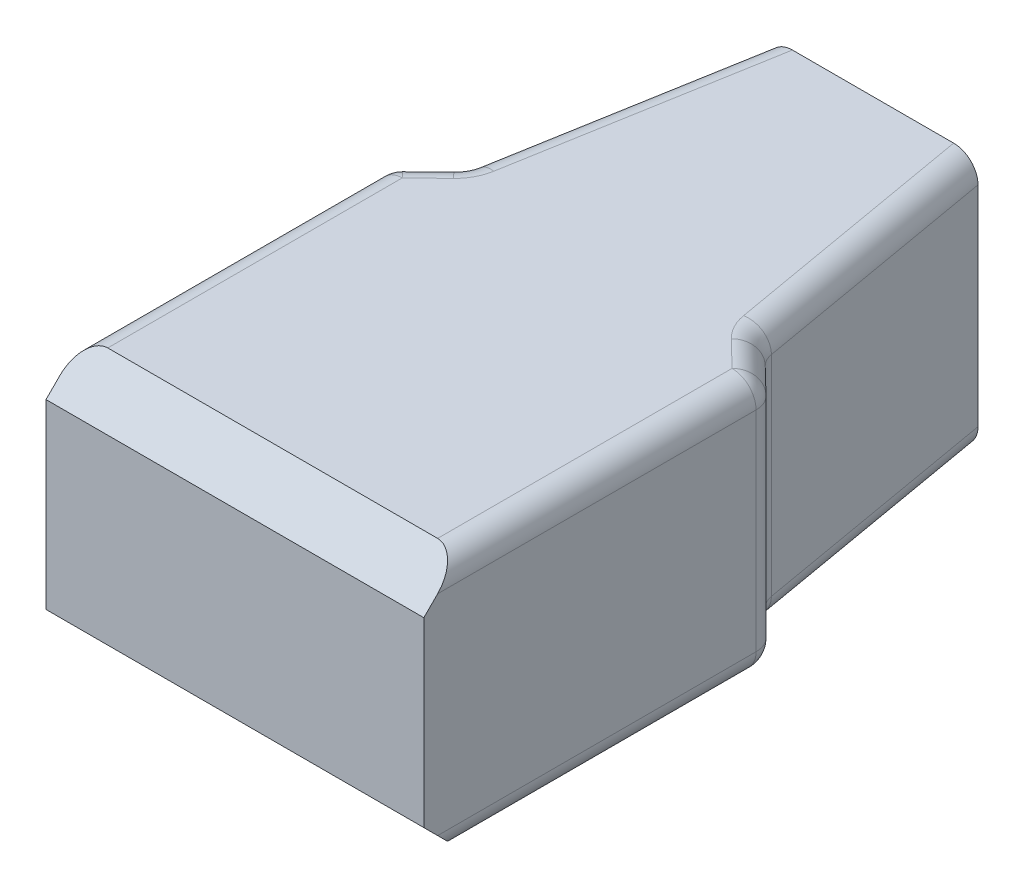
ISO-10303-21;
HEADER;
FILE_DESCRIPTION(('STEP AP214'),'2;1');
FILE_NAME('part.step','',(''),(''),'','','');
FILE_SCHEMA(('AUTOMOTIVE_DESIGN { 1 0 10303 214 1 1 1 1 }'));
ENDSEC;
DATA;
#1=APPLICATION_CONTEXT('core data for automotive mechanical design processes');
#2=APPLICATION_PROTOCOL_DEFINITION('international standard','automotive_design',2000,#1);
#3=PRODUCT_CONTEXT('',#1,'mechanical');
#4=PRODUCT('Part','Part','',(#3));
#5=PRODUCT_RELATED_PRODUCT_CATEGORY('part','',(#4));
#6=PRODUCT_DEFINITION_FORMATION('','',#4);
#7=PRODUCT_DEFINITION_CONTEXT('part definition',#1,'design');
#8=PRODUCT_DEFINITION('design','',#6,#7);
#9=PRODUCT_DEFINITION_SHAPE('','',#8);
#10=(LENGTH_UNIT() NAMED_UNIT(*) SI_UNIT(.MILLI.,.METRE.));
#11=(NAMED_UNIT(*) PLANE_ANGLE_UNIT() SI_UNIT($,.RADIAN.));
#12=(NAMED_UNIT(*) SI_UNIT($,.STERADIAN.) SOLID_ANGLE_UNIT());
#13=UNCERTAINTY_MEASURE_WITH_UNIT(LENGTH_MEASURE(1.E-05),#10,'distance_accuracy_value','');
#14=(GEOMETRIC_REPRESENTATION_CONTEXT(3) GLOBAL_UNCERTAINTY_ASSIGNED_CONTEXT((#13)) GLOBAL_UNIT_ASSIGNED_CONTEXT((#10,
#11,#12)) REPRESENTATION_CONTEXT('',''));
#15=CARTESIAN_POINT('',(0.,0.,0.));
#16=DIRECTION('',(0.,0.,1.));
#17=DIRECTION('',(1.,0.,0.));
#18=AXIS2_PLACEMENT_3D('',#15,#16,#17);
#19=CARTESIAN_POINT('',(-6.98373,4.43357,-14.0683804114636));
#20=DIRECTION('',(1.,0.,0.));
#21=DIRECTION('',(0.,0.,-1.));
#22=AXIS2_PLACEMENT_3D('',#19,#20,#21);
#23=SPHERICAL_SURFACE('',#22,1.016);
#24=CARTESIAN_POINT('',(-6.98373,4.43357,-14.0683804114636));
#25=DIRECTION('',(-0.717799964642432,0.,0.696249388336768));
#26=DIRECTION('',(0.696249388336768,0.,0.717799964642432));
#27=AXIS2_PLACEMENT_3D('',#24,#25,#26);
#28=CIRCLE('',#27,1.016);
#29=CARTESIAN_POINT('',(-7.69111937855016,4.43357,-14.7976651755403));
#30=VERTEX_POINT('',#29);
#31=CARTESIAN_POINT('',(-6.98373000001209,5.44957,-14.068380411476));
#32=VERTEX_POINT('',#31);
#33=EDGE_CURVE('E21',#30,#32,#28,.F.);
#34=ORIENTED_EDGE('',*,*,#33,.F.);
#35=CARTESIAN_POINT('',(-6.98373,4.43357,-14.0683804114636));
#36=DIRECTION('',(0.,-1.,0.));
#37=DIRECTION('',(0.,0.,-1.));
#38=AXIS2_PLACEMENT_3D('',#35,#36,#37);
#39=CIRCLE('',#38,1.016);
#40=CARTESIAN_POINT('',(-7.99973,4.43357,-14.0683804114636));
#41=VERTEX_POINT('',#40);
#42=EDGE_CURVE('E130',#41,#30,#39,.T.);
#43=ORIENTED_EDGE('',*,*,#42,.F.);
#44=CARTESIAN_POINT('',(-6.98373,4.43357,-14.0683804114636));
#45=DIRECTION('',(0.,2.45324373628771E-11,1.));
#46=DIRECTION('',(1.,0.,0.));
#47=AXIS2_PLACEMENT_3D('',#44,#45,#46);
#48=CIRCLE('',#47,1.016);
#49=EDGE_CURVE('E148',#41,#32,#48,.F.);
#50=ORIENTED_EDGE('',*,*,#49,.T.);
#51=EDGE_LOOP('',(#34,#43,#50));
#52=FACE_BOUND('',#51,.T.);
#53=ADVANCED_FACE('F17',(#52),#23,.T.);
#54=CARTESIAN_POINT('',(6.98373,4.43357,-14.0683804114636));
#55=DIRECTION('',(1.,0.,0.));
#56=DIRECTION('',(0.,0.,-1.));
#57=AXIS2_PLACEMENT_3D('',#54,#55,#56);
#58=SPHERICAL_SURFACE('',#57,1.016);
#59=CARTESIAN_POINT('',(6.98373,4.43357,-14.0683804114636));
#60=DIRECTION('',(0.,1.,0.));
#61=DIRECTION('',(1.,0.,0.));
#62=AXIS2_PLACEMENT_3D('',#59,#60,#61);
#63=CIRCLE('',#62,1.016);
#64=CARTESIAN_POINT('',(7.99973,4.43357,-14.0683804114636));
#65=VERTEX_POINT('',#64);
#66=CARTESIAN_POINT('',(7.69111937855016,4.43357,-14.7976651755403));
#67=VERTEX_POINT('',#66);
#68=EDGE_CURVE('E184',#65,#67,#63,.T.);
#69=ORIENTED_EDGE('',*,*,#68,.T.);
#70=CARTESIAN_POINT('',(6.98373,4.43357,-14.0683804114636));
#71=DIRECTION('',(-0.717799964642431,0.,-0.696249388336769));
#72=DIRECTION('',(-0.696249388336769,0.,0.717799964642431));
#73=AXIS2_PLACEMENT_3D('',#70,#71,#72);
#74=CIRCLE('',#73,1.016);
#75=CARTESIAN_POINT('',(6.98373,5.44957,-14.0683804114636));
#76=VERTEX_POINT('',#75);
#77=EDGE_CURVE('E193',#76,#67,#74,.T.);
#78=ORIENTED_EDGE('',*,*,#77,.F.);
#79=CARTESIAN_POINT('',(6.98373,4.43357,-14.0683804114636));
#80=DIRECTION('',(0.,0.,1.));
#81=DIRECTION('',(1.,0.,0.));
#82=AXIS2_PLACEMENT_3D('',#79,#80,#81);
#83=CIRCLE('',#82,1.016);
#84=EDGE_CURVE('E747',#76,#65,#83,.F.);
#85=ORIENTED_EDGE('',*,*,#84,.T.);
#86=EDGE_LOOP('',(#69,#78,#85));
#87=FACE_BOUND('',#86,.T.);
#88=ADVANCED_FACE('F199',(#87),#58,.T.);
#89=CARTESIAN_POINT('',(-7.99973,-5.44962,-14.49832));
#90=DIRECTION('',(0.696249388336768,0.,0.717799964642432));
#91=DIRECTION('',(0.717799964642432,0.,-0.696249388336768));
#92=AXIS2_PLACEMENT_3D('',#89,#90,#91);
#93=PLANE('',#92);
#94=DIRECTION('',(-0.717799964642432,0.,0.696249388336768));
#95=VECTOR('',#94,1.);
#96=CARTESIAN_POINT('',(-7.99973,4.43357,-14.49832));
#97=LINE('',#96,#95);
#98=CARTESIAN_POINT('',(-6.58681276999871,4.43357,-15.8688170822183));
#99=VERTEX_POINT('',#98);
#100=EDGE_CURVE('E123',#99,#30,#97,.T.);
#101=ORIENTED_EDGE('',*,*,#100,.F.);
#102=DIRECTION('',(0.,1.,0.));
#103=VECTOR('',#102,1.);
#104=CARTESIAN_POINT('',(-6.58681276999871,-5.44962,-15.8688170822183));
#105=LINE('',#104,#103);
#106=CARTESIAN_POINT('',(-6.58681276999871,-4.43357,-15.8688170822183));
#107=VERTEX_POINT('',#106);
#108=EDGE_CURVE('E177',#99,#107,#105,.F.);
#109=ORIENTED_EDGE('',*,*,#108,.T.);
#110=DIRECTION('',(0.717799964642432,0.,-0.696249388336768));
#111=VECTOR('',#110,1.);
#112=CARTESIAN_POINT('',(-7.99973,-4.43357,-14.49832));
#113=LINE('',#112,#111);
#114=CARTESIAN_POINT('',(-7.69111937855015,-4.43357,-14.7976651755403));
#115=VERTEX_POINT('',#114);
#116=EDGE_CURVE('E126',#115,#107,#113,.T.);
#117=ORIENTED_EDGE('',*,*,#116,.F.);
#118=DIRECTION('',(0.,-1.,0.));
#119=VECTOR('',#118,1.);
#120=CARTESIAN_POINT('',(-7.69111937855016,-5.44962,-14.7976651755403));
#121=LINE('',#120,#119);
#122=EDGE_CURVE('E119',#30,#115,#121,.T.);
#123=ORIENTED_EDGE('',*,*,#122,.F.);
#124=EDGE_LOOP('',(#101,#109,#117,#123));
#125=FACE_BOUND('',#124,.T.);
#126=ADVANCED_FACE('F121',(#125),#93,.F.);
#127=CARTESIAN_POINT('',(7.99973,-5.44962,-14.49832));
#128=DIRECTION('',(-0.696249388336769,0.,0.717799964642431));
#129=DIRECTION('',(0.717799964642431,0.,0.696249388336769));
#130=AXIS2_PLACEMENT_3D('',#127,#128,#129);
#131=PLANE('',#130);
#132=DIRECTION('',(0.717799964642431,0.,0.696249388336769));
#133=VECTOR('',#132,1.);
#134=CARTESIAN_POINT('',(7.99973,-4.43357,-14.49832));
#135=LINE('',#134,#133);
#136=CARTESIAN_POINT('',(6.58681276999871,-4.43357,-15.8688170822183));
#137=VERTEX_POINT('',#136);
#138=CARTESIAN_POINT('',(7.69111937855016,-4.43357,-14.7976651755403));
#139=VERTEX_POINT('',#138);
#140=EDGE_CURVE('E156',#137,#139,#135,.T.);
#141=ORIENTED_EDGE('',*,*,#140,.F.);
#142=DIRECTION('',(0.,1.,0.));
#143=VECTOR('',#142,1.);
#144=CARTESIAN_POINT('',(6.58681276999871,5.44957,-15.8688170822183));
#145=LINE('',#144,#143);
#146=CARTESIAN_POINT('',(6.58681276999871,4.43357,-15.8688170822183));
#147=VERTEX_POINT('',#146);
#148=EDGE_CURVE('E170',#137,#147,#145,.T.);
#149=ORIENTED_EDGE('',*,*,#148,.T.);
#150=DIRECTION('',(-0.717799964642431,0.,-0.696249388336769));
#151=VECTOR('',#150,1.);
#152=CARTESIAN_POINT('',(7.99973,4.43357,-14.49832));
#153=LINE('',#152,#151);
#154=EDGE_CURVE('E189',#67,#147,#153,.T.);
#155=ORIENTED_EDGE('',*,*,#154,.F.);
#156=DIRECTION('',(0.,-1.,0.));
#157=VECTOR('',#156,1.);
#158=CARTESIAN_POINT('',(7.69111937855016,-5.44957,-14.7976651755403));
#159=LINE('',#158,#157);
#160=EDGE_CURVE('E633',#139,#67,#159,.F.);
#161=ORIENTED_EDGE('',*,*,#160,.F.);
#162=EDGE_LOOP('',(#141,#149,#155,#161));
#163=FACE_BOUND('',#162,.T.);
#164=ADVANCED_FACE('F205',(#163),#131,.F.);
#165=CARTESIAN_POINT('',(-6.98373,-5.44962,-14.0683804114636));
#166=DIRECTION('',(0.,-1.,0.));
#167=DIRECTION('',(0.,0.,-1.));
#168=AXIS2_PLACEMENT_3D('',#165,#166,#167);
#169=CYLINDRICAL_SURFACE('',#168,1.016);
#170=ORIENTED_EDGE('',*,*,#42,.T.);
#171=ORIENTED_EDGE('',*,*,#122,.T.);
#172=CARTESIAN_POINT('',(-6.98373,-4.43357,-14.0683804114636));
#173=DIRECTION('',(0.,-1.,0.));
#174=DIRECTION('',(0.,0.,-1.));
#175=AXIS2_PLACEMENT_3D('',#172,#173,#174);
#176=CIRCLE('',#175,1.016);
#177=CARTESIAN_POINT('',(-7.99973,-4.43357,-14.0683804114636));
#178=VERTEX_POINT('',#177);
#179=EDGE_CURVE('E154',#115,#178,#176,.F.);
#180=ORIENTED_EDGE('',*,*,#179,.T.);
#181=DIRECTION('',(0.,1.,0.));
#182=VECTOR('',#181,1.);
#183=CARTESIAN_POINT('',(-7.99973,-5.44957,-14.0683804114636));
#184=LINE('',#183,#182);
#185=EDGE_CURVE('E152',#41,#178,#184,.F.);
#186=ORIENTED_EDGE('',*,*,#185,.F.);
#187=EDGE_LOOP('',(#170,#171,#180,#186));
#188=FACE_BOUND('',#187,.T.);
#189=ADVANCED_FACE('F150',(#188),#169,.T.);
#190=CARTESIAN_POINT('',(-7.29234062144984,4.43357,-13.7690352359233));
#191=DIRECTION('',(-0.717799964642432,0.,0.696249388336768));
#192=DIRECTION('',(0.696249388336768,0.,0.717799964642432));
#193=AXIS2_PLACEMENT_3D('',#190,#191,#192);
#194=CYLINDRICAL_SURFACE('',#193,1.016);
#195=ORIENTED_EDGE('',*,*,#33,.T.);
#196=DIRECTION('',(-0.717799964642432,0.,0.696249388336768));
#197=VECTOR('',#196,1.);
#198=CARTESIAN_POINT('',(-5.87942339144855,5.44957,-15.1395323181416));
#199=LINE('',#198,#197);
#200=CARTESIAN_POINT('',(-5.87942339144855,5.44957,-15.1395323181416));
#201=VERTEX_POINT('',#200);
#202=EDGE_CURVE('E272',#201,#32,#199,.T.);
#203=ORIENTED_EDGE('',*,*,#202,.F.);
#204=CARTESIAN_POINT('',(-5.87942339144856,4.43357,-15.1395323181416));
#205=DIRECTION('',(0.717799964642432,0.,-0.696249388336768));
#206=DIRECTION('',(0.696249388336768,0.,0.717799964642432));
#207=AXIS2_PLACEMENT_3D('',#204,#205,#206);
#208=CIRCLE('',#207,1.016);
#209=EDGE_CURVE('E139',#99,#201,#208,.T.);
#210=ORIENTED_EDGE('',*,*,#209,.F.);
#211=ORIENTED_EDGE('',*,*,#100,.T.);
#212=EDGE_LOOP('',(#195,#203,#210,#211));
#213=FACE_BOUND('',#212,.T.);
#214=ADVANCED_FACE('F135',(#213),#194,.T.);
#215=CARTESIAN_POINT('',(-6.98373,4.43357,-16.09852));
#216=DIRECTION('',(0.,0.,1.));
#217=DIRECTION('',(1.,0.,0.));
#218=AXIS2_PLACEMENT_3D('',#215,#216,#217);
#219=CYLINDRICAL_SURFACE('',#218,1.016);
#220=ORIENTED_EDGE('',*,*,#49,.F.);
#221=DIRECTION('',(0.,0.,1.));
#222=VECTOR('',#221,1.);
#223=CARTESIAN_POINT('',(-7.99973,4.43357,-16.09852));
#224=LINE('',#223,#222);
#225=CARTESIAN_POINT('',(-7.99973,4.43357,-0.584200000000001));
#226=VERTEX_POINT('',#225);
#227=EDGE_CURVE('E276',#226,#41,#224,.F.);
#228=ORIENTED_EDGE('',*,*,#227,.F.);
#229=CARTESIAN_POINT('',(-6.98373,4.43357,-0.5842));
#230=DIRECTION('',(0.,0.707106781186548,0.707106781186547));
#231=DIRECTION('',(0.,-0.707106781186547,0.707106781186548));
#232=AXIS2_PLACEMENT_3D('',#229,#230,#231);
#233=ELLIPSE('',#232,1.43684097937107,1.016);
#234=CARTESIAN_POINT('',(-6.98373,5.44957,-1.6002));
#235=VERTEX_POINT('',#234);
#236=EDGE_CURVE('E149',#235,#226,#233,.T.);
#237=ORIENTED_EDGE('',*,*,#236,.F.);
#238=DIRECTION('',(0.,0.,1.));
#239=VECTOR('',#238,1.);
#240=CARTESIAN_POINT('',(-6.98373,5.44957,-16.09852));
#241=LINE('',#240,#239);
#242=EDGE_CURVE('E265',#32,#235,#241,.T.);
#243=ORIENTED_EDGE('',*,*,#242,.F.);
#244=EDGE_LOOP('',(#220,#228,#237,#243));
#245=FACE_BOUND('',#244,.T.);
#246=ADVANCED_FACE('F213',(#245),#219,.T.);
#247=CARTESIAN_POINT('',(-7.99973,3.84937,0.));
#248=DIRECTION('',(0.,0.707106781186548,0.707106781186547));
#249=DIRECTION('',(0.,-0.707106781186547,0.707106781186548));
#250=AXIS2_PLACEMENT_3D('',#247,#248,#249);
#251=PLANE('',#250);
#252=DIRECTION('',(0.,-0.707106781186547,0.707106781186548));
#253=VECTOR('',#252,1.);
#254=CARTESIAN_POINT('',(7.99973000000001,3.84937,0.));
#255=LINE('',#254,#253);
#256=CARTESIAN_POINT('',(7.99973,3.84936999999999,0.));
#257=VERTEX_POINT('',#256);
#258=CARTESIAN_POINT('',(7.99973,4.43357,-0.584199999999999));
#259=VERTEX_POINT('',#258);
#260=EDGE_CURVE('E266',#257,#259,#255,.F.);
#261=ORIENTED_EDGE('',*,*,#260,.T.);
#262=CARTESIAN_POINT('',(6.98373,4.43357,-0.5842));
#263=DIRECTION('',(0.,0.707106781186548,0.707106781186547));
#264=DIRECTION('',(0.,-0.707106781186547,0.707106781186548));
#265=AXIS2_PLACEMENT_3D('',#262,#263,#264);
#266=ELLIPSE('',#265,1.43684097937107,1.016);
#267=CARTESIAN_POINT('',(6.98373,5.44957,-1.6002));
#268=VERTEX_POINT('',#267);
#269=EDGE_CURVE('E629',#268,#259,#266,.F.);
#270=ORIENTED_EDGE('',*,*,#269,.F.);
#271=DIRECTION('',(1.,0.,0.));
#272=VECTOR('',#271,1.);
#273=CARTESIAN_POINT('',(-7.99973,5.44957,-1.6002));
#274=LINE('',#273,#272);
#275=EDGE_CURVE('E262',#235,#268,#274,.T.);
#276=ORIENTED_EDGE('',*,*,#275,.F.);
#277=ORIENTED_EDGE('',*,*,#236,.T.);
#278=DIRECTION('',(0.,0.707106781186546,-0.707106781186549));
#279=VECTOR('',#278,1.);
#280=CARTESIAN_POINT('',(-7.99973,3.84936999999999,0.));
#281=LINE('',#280,#279);
#282=CARTESIAN_POINT('',(-7.99973,3.84937,0.));
#283=VERTEX_POINT('',#282);
#284=EDGE_CURVE('E273',#283,#226,#281,.T.);
#285=ORIENTED_EDGE('',*,*,#284,.F.);
#286=DIRECTION('',(-1.,0.,0.));
#287=VECTOR('',#286,1.);
#288=CARTESIAN_POINT('',(-7.99973,3.84936999999999,0.));
#289=LINE('',#288,#287);
#290=EDGE_CURVE('E632',#283,#257,#289,.F.);
#291=ORIENTED_EDGE('',*,*,#290,.T.);
#292=EDGE_LOOP('',(#261,#270,#276,#277,#285,#291));
#293=FACE_BOUND('',#292,.T.);
#294=ADVANCED_FACE('F216',(#293),#251,.T.);
#295=CARTESIAN_POINT('',(7.29234062144984,4.43357,-13.7690352359233));
#296=DIRECTION('',(-0.717799964642431,0.,-0.696249388336769));
#297=DIRECTION('',(-0.696249388336769,0.,0.717799964642431));
#298=AXIS2_PLACEMENT_3D('',#295,#296,#297);
#299=CYLINDRICAL_SURFACE('',#298,1.016);
#300=CARTESIAN_POINT('',(5.87942339144855,4.43357,-15.1395323181416));
#301=DIRECTION('',(0.717799964642431,0.,0.696249388336769));
#302=DIRECTION('',(-0.696249388336769,0.,0.717799964642431));
#303=AXIS2_PLACEMENT_3D('',#300,#301,#302);
#304=CIRCLE('',#303,1.016);
#305=CARTESIAN_POINT('',(5.87942339144855,5.44957,-15.1395323181416));
#306=VERTEX_POINT('',#305);
#307=EDGE_CURVE('E192',#306,#147,#304,.F.);
#308=ORIENTED_EDGE('',*,*,#307,.F.);
#309=DIRECTION('',(-0.717799964642431,0.,-0.696249388336769));
#310=VECTOR('',#309,1.);
#311=CARTESIAN_POINT('',(6.98373,5.44957,-14.0683804114636));
#312=LINE('',#311,#310);
#313=EDGE_CURVE('E261',#76,#306,#312,.T.);
#314=ORIENTED_EDGE('',*,*,#313,.F.);
#315=ORIENTED_EDGE('',*,*,#77,.T.);
#316=ORIENTED_EDGE('',*,*,#154,.T.);
#317=EDGE_LOOP('',(#308,#314,#315,#316));
#318=FACE_BOUND('',#317,.T.);
#319=ADVANCED_FACE('F220',(#318),#299,.T.);
#320=CARTESIAN_POINT('',(7.29420214854887,4.43357,-16.5981018462951));
#321=DIRECTION('',(0.,1.,0.));
#322=DIRECTION('',(0.,0.,1.));
#323=AXIS2_PLACEMENT_3D('',#320,#321,#322);
#324=TOROIDAL_SURFACE('',#323,2.032,1.016);
#325=CARTESIAN_POINT('',(7.29420214854887,4.43357,-16.5981018462951));
#326=DIRECTION('',(0.,1.,0.));
#327=DIRECTION('',(0.,0.,1.));
#328=AXIS2_PLACEMENT_3D('',#325,#326,#327);
#329=CIRCLE('',#328,1.016);
#330=CARTESIAN_POINT('',(6.29331254450897,4.43357,-16.4235280781486));
#331=VERTEX_POINT('',#330);
#332=EDGE_CURVE('E173',#147,#331,#329,.F.);
#333=ORIENTED_EDGE('',*,*,#332,.T.);
#334=CARTESIAN_POINT('',(5.29242294046908,4.43357,-16.2489543100021));
#335=DIRECTION('',(0.171824574947336,0.,0.985127563031391));
#336=DIRECTION('',(0.985127563031391,0.,-0.171824574947336));
#337=AXIS2_PLACEMENT_3D('',#334,#335,#336);
#338=CIRCLE('',#337,1.016);
#339=CARTESIAN_POINT('',(5.29242294046908,5.44957,-16.2489543100021));
#340=VERTEX_POINT('',#339);
#341=EDGE_CURVE('E636',#340,#331,#338,.F.);
#342=ORIENTED_EDGE('',*,*,#341,.F.);
#343=CARTESIAN_POINT('',(7.29420214854887,5.44957,-16.5981018462951));
#344=DIRECTION('',(0.,1.,0.));
#345=DIRECTION('',(-0.985127563031391,0.,0.171824574947334));
#346=AXIS2_PLACEMENT_3D('',#343,#344,#345);
#347=CIRCLE('',#346,2.032);
#348=EDGE_CURVE('E245',#306,#340,#347,.F.);
#349=ORIENTED_EDGE('',*,*,#348,.F.);
#350=ORIENTED_EDGE('',*,*,#307,.T.);
#351=EDGE_LOOP('',(#333,#342,#349,#350));
#352=FACE_BOUND('',#351,.T.);
#353=ADVANCED_FACE('F224',(#352),#324,.T.);
#354=CARTESIAN_POINT('',(-7.29420214854887,4.43357,-16.5981018462951));
#355=DIRECTION('',(0.,1.,0.));
#356=DIRECTION('',(0.,0.,1.));
#357=AXIS2_PLACEMENT_3D('',#354,#355,#356);
#358=TOROIDAL_SURFACE('',#357,2.032,1.016);
#359=ORIENTED_EDGE('',*,*,#209,.T.);
#360=CARTESIAN_POINT('',(-7.29420214854887,5.44957,-16.5981018462951));
#361=DIRECTION('',(0.,1.,0.));
#362=DIRECTION('',(0.696249388336767,0.,0.717799964642433));
#363=AXIS2_PLACEMENT_3D('',#360,#361,#362);
#364=CIRCLE('',#363,2.032);
#365=CARTESIAN_POINT('',(-5.29242294046908,5.44957,-16.2489543100021));
#366=VERTEX_POINT('',#365);
#367=EDGE_CURVE('E688',#366,#201,#364,.F.);
#368=ORIENTED_EDGE('',*,*,#367,.F.);
#369=CARTESIAN_POINT('',(-5.29242294046908,4.43357,-16.2489543100021));
#370=DIRECTION('',(0.171824574947336,0.,-0.985127563031391));
#371=DIRECTION('',(-0.985127563031391,0.,-0.171824574947336));
#372=AXIS2_PLACEMENT_3D('',#369,#370,#371);
#373=CIRCLE('',#372,1.016);
#374=CARTESIAN_POINT('',(-6.29331254450897,4.43357,-16.4235280781486));
#375=VERTEX_POINT('',#374);
#376=EDGE_CURVE('E180',#375,#366,#373,.T.);
#377=ORIENTED_EDGE('',*,*,#376,.F.);
#378=CARTESIAN_POINT('',(-7.29420214854887,4.43357,-16.5981018462951));
#379=DIRECTION('',(0.,1.,0.));
#380=DIRECTION('',(0.,0.,1.));
#381=AXIS2_PLACEMENT_3D('',#378,#379,#380);
#382=CIRCLE('',#381,1.016);
#383=EDGE_CURVE('E637',#375,#99,#382,.F.);
#384=ORIENTED_EDGE('',*,*,#383,.T.);
#385=EDGE_LOOP('',(#359,#368,#377,#384));
#386=FACE_BOUND('',#385,.T.);
#387=ADVANCED_FACE('F230',(#386),#358,.T.);
#388=CARTESIAN_POINT('',(-5.3978165040824,4.43357,-15.644697878619));
#389=DIRECTION('',(0.171824574947336,0.,-0.985127563031391));
#390=DIRECTION('',(-0.985127563031391,0.,-0.171824574947336));
#391=AXIS2_PLACEMENT_3D('',#388,#389,#390);
#392=CYLINDRICAL_SURFACE('',#391,1.016);
#393=ORIENTED_EDGE('',*,*,#376,.T.);
#394=DIRECTION('',(-0.171824574947336,0.,0.985127563031391));
#395=VECTOR('',#394,1.);
#396=CARTESIAN_POINT('',(-3.4136614829113,5.44957,-27.02052));
#397=LINE('',#396,#395);
#398=CARTESIAN_POINT('',(-3.4136614829113,5.44957,-27.02052));
#399=VERTEX_POINT('',#398);
#400=EDGE_CURVE('E701',#399,#366,#397,.T.);
#401=ORIENTED_EDGE('',*,*,#400,.F.);
#402=CARTESIAN_POINT('',(-3.4136614829113,4.43357,-27.02052));
#403=DIRECTION('',(0.,0.,1.));
#404=DIRECTION('',(1.,0.,0.));
#405=AXIS2_PLACEMENT_3D('',#402,#403,#404);
#406=ELLIPSE('',#405,1.0313385170887,1.016);
#407=CARTESIAN_POINT('',(-4.445,4.43357,-27.02052));
#408=VERTEX_POINT('',#407);
#409=EDGE_CURVE('E638',#399,#408,#406,.T.);
#410=ORIENTED_EDGE('',*,*,#409,.T.);
#411=DIRECTION('',(0.171824574947336,0.,-0.985127563031391));
#412=VECTOR('',#411,1.);
#413=CARTESIAN_POINT('',(-4.445,4.43357,-27.02052));
#414=LINE('',#413,#412);
#415=EDGE_CURVE('E300',#408,#375,#414,.F.);
#416=ORIENTED_EDGE('',*,*,#415,.T.);
#417=EDGE_LOOP('',(#393,#401,#410,#416));
#418=FACE_BOUND('',#417,.T.);
#419=ADVANCED_FACE('F340',(#418),#392,.T.);
#420=CARTESIAN_POINT('',(-7.29420214854887,-5.44962,-16.5981018462951));
#421=DIRECTION('',(0.,1.,0.));
#422=DIRECTION('',(0.,0.,1.));
#423=AXIS2_PLACEMENT_3D('',#420,#421,#422);
#424=CYLINDRICAL_SURFACE('',#423,1.016);
#425=DIRECTION('',(0.,1.,0.));
#426=VECTOR('',#425,1.);
#427=CARTESIAN_POINT('',(-6.29331254450897,5.44957,-16.4235280781486));
#428=LINE('',#427,#426);
#429=CARTESIAN_POINT('',(-6.29331254450897,-4.43357,-16.4235280781486));
#430=VERTEX_POINT('',#429);
#431=EDGE_CURVE('E295',#375,#430,#428,.F.);
#432=ORIENTED_EDGE('',*,*,#431,.T.);
#433=CARTESIAN_POINT('',(-7.29420214854887,-4.43357,-16.5981018462951));
#434=DIRECTION('',(0.,1.,0.));
#435=DIRECTION('',(0.,0.,1.));
#436=AXIS2_PLACEMENT_3D('',#433,#434,#435);
#437=CIRCLE('',#436,1.016);
#438=EDGE_CURVE('E179',#107,#430,#437,.T.);
#439=ORIENTED_EDGE('',*,*,#438,.F.);
#440=ORIENTED_EDGE('',*,*,#108,.F.);
#441=ORIENTED_EDGE('',*,*,#383,.F.);
#442=EDGE_LOOP('',(#432,#439,#440,#441));
#443=FACE_BOUND('',#442,.T.);
#444=ADVANCED_FACE('F337',(#443),#424,.F.);
#445=CARTESIAN_POINT('',(4.92545349397874,4.43357,-18.35291246988));
#446=DIRECTION('',(0.171824574947336,0.,0.985127563031391));
#447=DIRECTION('',(0.985127563031391,0.,-0.171824574947336));
#448=AXIS2_PLACEMENT_3D('',#445,#446,#447);
#449=CYLINDRICAL_SURFACE('',#448,1.016);
#450=ORIENTED_EDGE('',*,*,#341,.T.);
#451=DIRECTION('',(0.171824574947336,0.,0.985127563031391));
#452=VECTOR('',#451,1.);
#453=CARTESIAN_POINT('',(4.445,4.43357,-27.02052));
#454=LINE('',#453,#452);
#455=CARTESIAN_POINT('',(4.445,4.43357,-27.02052));
#456=VERTEX_POINT('',#455);
#457=EDGE_CURVE('E291',#331,#456,#454,.F.);
#458=ORIENTED_EDGE('',*,*,#457,.T.);
#459=CARTESIAN_POINT('',(3.4136614829113,4.43357,-27.02052));
#460=DIRECTION('',(0.,0.,1.));
#461=DIRECTION('',(1.,0.,0.));
#462=AXIS2_PLACEMENT_3D('',#459,#460,#461);
#463=ELLIPSE('',#462,1.0313385170887,1.016);
#464=CARTESIAN_POINT('',(3.4136614829113,5.44957,-27.02052));
#465=VERTEX_POINT('',#464);
#466=EDGE_CURVE('E634',#456,#465,#463,.T.);
#467=ORIENTED_EDGE('',*,*,#466,.T.);
#468=DIRECTION('',(-0.171824574947336,0.,-0.985127563031391));
#469=VECTOR('',#468,1.);
#470=CARTESIAN_POINT('',(5.29242294046908,5.44957,-16.2489543100021));
#471=LINE('',#470,#469);
#472=EDGE_CURVE('E716',#340,#465,#471,.T.);
#473=ORIENTED_EDGE('',*,*,#472,.F.);
#474=EDGE_LOOP('',(#450,#458,#467,#473));
#475=FACE_BOUND('',#474,.T.);
#476=ADVANCED_FACE('F333',(#475),#449,.T.);
#477=CARTESIAN_POINT('',(7.29420214854887,5.44957,-16.5981018462951));
#478=DIRECTION('',(0.,1.,0.));
#479=DIRECTION('',(0.,0.,1.));
#480=AXIS2_PLACEMENT_3D('',#477,#478,#479);
#481=CYLINDRICAL_SURFACE('',#480,1.016);
#482=ORIENTED_EDGE('',*,*,#148,.F.);
#483=CARTESIAN_POINT('',(7.29420214854887,-4.43357,-16.5981018462951));
#484=DIRECTION('',(0.,1.,0.));
#485=DIRECTION('',(0.,0.,1.));
#486=AXIS2_PLACEMENT_3D('',#483,#484,#485);
#487=CIRCLE('',#486,1.016);
#488=CARTESIAN_POINT('',(6.29331254450897,-4.43357,-16.4235280781486));
#489=VERTEX_POINT('',#488);
#490=EDGE_CURVE('E174',#489,#137,#487,.T.);
#491=ORIENTED_EDGE('',*,*,#490,.F.);
#492=DIRECTION('',(0.,1.,0.));
#493=VECTOR('',#492,1.);
#494=CARTESIAN_POINT('',(6.29331254450897,5.44957,-16.4235280781486));
#495=LINE('',#494,#493);
#496=EDGE_CURVE('E294',#489,#331,#495,.T.);
#497=ORIENTED_EDGE('',*,*,#496,.T.);
#498=ORIENTED_EDGE('',*,*,#332,.F.);
#499=EDGE_LOOP('',(#482,#491,#497,#498));
#500=FACE_BOUND('',#499,.T.);
#501=ADVANCED_FACE('F329',(#500),#481,.F.);
#502=CARTESIAN_POINT('',(6.98373,-5.44957,-14.0683804114636));
#503=DIRECTION('',(0.,-1.,0.));
#504=DIRECTION('',(0.,0.,-1.));
#505=AXIS2_PLACEMENT_3D('',#502,#503,#504);
#506=CYLINDRICAL_SURFACE('',#505,1.016);
#507=CARTESIAN_POINT('',(6.98373,-4.43357,-14.0683804114636));
#508=DIRECTION('',(0.,1.,0.));
#509=DIRECTION('',(1.,0.,0.));
#510=AXIS2_PLACEMENT_3D('',#507,#508,#509);
#511=CIRCLE('',#510,1.016);
#512=CARTESIAN_POINT('',(7.99973,-4.43357,-14.0683804114636));
#513=VERTEX_POINT('',#512);
#514=EDGE_CURVE('E734',#139,#513,#511,.F.);
#515=ORIENTED_EDGE('',*,*,#514,.F.);
#516=ORIENTED_EDGE('',*,*,#160,.T.);
#517=ORIENTED_EDGE('',*,*,#68,.F.);
#518=DIRECTION('',(0.,1.,0.));
#519=VECTOR('',#518,1.);
#520=CARTESIAN_POINT('',(7.99973,-5.44957,-14.0683804114636));
#521=LINE('',#520,#519);
#522=EDGE_CURVE('E526',#513,#65,#521,.T.);
#523=ORIENTED_EDGE('',*,*,#522,.F.);
#524=EDGE_LOOP('',(#515,#516,#517,#523));
#525=FACE_BOUND('',#524,.T.);
#526=ADVANCED_FACE('F325',(#525),#506,.T.);
#527=CARTESIAN_POINT('',(6.98373,4.43357,-16.09852));
#528=DIRECTION('',(0.,0.,1.));
#529=DIRECTION('',(1.,0.,0.));
#530=AXIS2_PLACEMENT_3D('',#527,#528,#529);
#531=CYLINDRICAL_SURFACE('',#530,1.016);
#532=ORIENTED_EDGE('',*,*,#84,.F.);
#533=DIRECTION('',(0.,0.,1.));
#534=VECTOR('',#533,1.);
#535=CARTESIAN_POINT('',(6.98373,5.44957,-16.09852));
#536=LINE('',#535,#534);
#537=EDGE_CURVE('E258',#268,#76,#536,.F.);
#538=ORIENTED_EDGE('',*,*,#537,.F.);
#539=ORIENTED_EDGE('',*,*,#269,.T.);
#540=DIRECTION('',(0.,0.,-1.));
#541=VECTOR('',#540,1.);
#542=CARTESIAN_POINT('',(7.99973,4.43357,-16.09852));
#543=LINE('',#542,#541);
#544=EDGE_CURVE('E529',#65,#259,#543,.F.);
#545=ORIENTED_EDGE('',*,*,#544,.F.);
#546=EDGE_LOOP('',(#532,#538,#539,#545));
#547=FACE_BOUND('',#546,.T.);
#548=ADVANCED_FACE('F321',(#547),#531,.T.);
#549=CARTESIAN_POINT('',(-7.99973,5.44957,0.));
#550=DIRECTION('',(0.,0.,-1.));
#551=DIRECTION('',(-1.,0.,0.));
#552=AXIS2_PLACEMENT_3D('',#549,#550,#551);
#553=PLANE('',#552);
#554=DIRECTION('',(1.,0.,0.));
#555=VECTOR('',#554,1.);
#556=CARTESIAN_POINT('',(-7.99973,-3.84937,0.));
#557=LINE('',#556,#555);
#558=CARTESIAN_POINT('',(7.99973000000001,-3.84937,0.));
#559=VERTEX_POINT('',#558);
#560=CARTESIAN_POINT('',(-7.99973,-3.84937,0.));
#561=VERTEX_POINT('',#560);
#562=EDGE_CURVE('E518',#559,#561,#557,.F.);
#563=ORIENTED_EDGE('',*,*,#562,.F.);
#564=DIRECTION('',(0.,1.,0.));
#565=VECTOR('',#564,1.);
#566=CARTESIAN_POINT('',(7.99973,-5.44957,0.));
#567=LINE('',#566,#565);
#568=EDGE_CURVE('E523',#257,#559,#567,.F.);
#569=ORIENTED_EDGE('',*,*,#568,.F.);
#570=ORIENTED_EDGE('',*,*,#290,.F.);
#571=DIRECTION('',(0.,1.,0.));
#572=VECTOR('',#571,1.);
#573=CARTESIAN_POINT('',(-7.99973,-5.44957,0.));
#574=LINE('',#573,#572);
#575=EDGE_CURVE('E277',#561,#283,#574,.T.);
#576=ORIENTED_EDGE('',*,*,#575,.F.);
#577=EDGE_LOOP('',(#563,#569,#570,#576));
#578=FACE_BOUND('',#577,.T.);
#579=ADVANCED_FACE('F318',(#578),#553,.F.);
#580=CARTESIAN_POINT('',(-7.99973,-5.44957,-16.09852));
#581=DIRECTION('',(-1.,0.,0.));
#582=DIRECTION('',(0.,0.,1.));
#583=AXIS2_PLACEMENT_3D('',#580,#581,#582);
#584=PLANE('',#583);
#585=ORIENTED_EDGE('',*,*,#284,.T.);
#586=ORIENTED_EDGE('',*,*,#227,.T.);
#587=ORIENTED_EDGE('',*,*,#185,.T.);
#588=DIRECTION('',(0.,0.,1.));
#589=VECTOR('',#588,1.);
#590=CARTESIAN_POINT('',(-7.99973,-4.43357,-16.09852));
#591=LINE('',#590,#589);
#592=CARTESIAN_POINT('',(-7.99973,-4.43357,-0.584199999999998));
#593=VERTEX_POINT('',#592);
#594=EDGE_CURVE('E504',#593,#178,#591,.F.);
#595=ORIENTED_EDGE('',*,*,#594,.F.);
#596=DIRECTION('',(0.,-0.707106781186547,-0.707106781186548));
#597=VECTOR('',#596,1.);
#598=CARTESIAN_POINT('',(-7.99973,-3.84937,0.));
#599=LINE('',#598,#597);
#600=EDGE_CURVE('E519',#561,#593,#599,.T.);
#601=ORIENTED_EDGE('',*,*,#600,.F.);
#602=ORIENTED_EDGE('',*,*,#575,.T.);
#603=EDGE_LOOP('',(#585,#586,#587,#595,#601,#602));
#604=FACE_BOUND('',#603,.T.);
#605=ADVANCED_FACE('F312',(#604),#584,.T.);
#606=CARTESIAN_POINT('',(-6.98373,-4.43357,-14.0683804114636));
#607=DIRECTION('',(1.,0.,0.));
#608=DIRECTION('',(0.,0.,-1.));
#609=AXIS2_PLACEMENT_3D('',#606,#607,#608);
#610=SPHERICAL_SURFACE('',#609,1.016);
#611=CARTESIAN_POINT('',(-6.98373,-4.43357,-14.0683804114636));
#612=DIRECTION('',(0.,0.,1.));
#613=DIRECTION('',(1.,0.,0.));
#614=AXIS2_PLACEMENT_3D('',#611,#612,#613);
#615=CIRCLE('',#614,1.016);
#616=CARTESIAN_POINT('',(-6.98373,-5.44957,-14.0683804114636));
#617=VERTEX_POINT('',#616);
#618=EDGE_CURVE('E507',#178,#617,#615,.T.);
#619=ORIENTED_EDGE('',*,*,#618,.F.);
#620=ORIENTED_EDGE('',*,*,#179,.F.);
#621=CARTESIAN_POINT('',(-6.98373,-4.43357,-14.0683804114636));
#622=DIRECTION('',(0.717799964642432,0.,-0.696249388336768));
#623=DIRECTION('',(-0.696249388336768,0.,-0.717799964642432));
#624=AXIS2_PLACEMENT_3D('',#621,#622,#623);
#625=CIRCLE('',#624,1.016);
#626=EDGE_CURVE('E499',#617,#115,#625,.T.);
#627=ORIENTED_EDGE('',*,*,#626,.F.);
#628=EDGE_LOOP('',(#619,#620,#627));
#629=FACE_BOUND('',#628,.T.);
#630=ADVANCED_FACE('F307',(#629),#610,.T.);
#631=CARTESIAN_POINT('',(-7.99973,5.44957,-16.09852));
#632=DIRECTION('',(0.,1.,0.));
#633=DIRECTION('',(0.,0.,1.));
#634=AXIS2_PLACEMENT_3D('',#631,#632,#633);
#635=PLANE('',#634);
#636=ORIENTED_EDGE('',*,*,#400,.T.);
#637=ORIENTED_EDGE('',*,*,#367,.T.);
#638=ORIENTED_EDGE('',*,*,#202,.T.);
#639=ORIENTED_EDGE('',*,*,#242,.T.);
#640=ORIENTED_EDGE('',*,*,#275,.T.);
#641=ORIENTED_EDGE('',*,*,#537,.T.);
#642=ORIENTED_EDGE('',*,*,#313,.T.);
#643=ORIENTED_EDGE('',*,*,#348,.T.);
#644=ORIENTED_EDGE('',*,*,#472,.T.);
#645=DIRECTION('',(1.,0.,0.));
#646=VECTOR('',#645,1.);
#647=CARTESIAN_POINT('',(-4.445,5.44957,-27.02052));
#648=LINE('',#647,#646);
#649=EDGE_CURVE('E458',#465,#399,#648,.F.);
#650=ORIENTED_EDGE('',*,*,#649,.T.);
#651=EDGE_LOOP('',(#636,#637,#638,#639,#640,#641,#642,#643,#644,#650));
#652=FACE_BOUND('',#651,.T.);
#653=ADVANCED_FACE('F311',(#652),#635,.T.);
#654=CARTESIAN_POINT('',(-4.445,5.44957,-27.02052));
#655=DIRECTION('',(0.985127563031391,0.,0.171824574947336));
#656=DIRECTION('',(0.171824574947336,0.,-0.985127563031391));
#657=AXIS2_PLACEMENT_3D('',#654,#655,#656);
#658=PLANE('',#657);
#659=DIRECTION('',(0.171824574947336,0.,-0.985127563031391));
#660=VECTOR('',#659,1.);
#661=CARTESIAN_POINT('',(-4.445,-4.43357,-27.02052));
#662=LINE('',#661,#660);
#663=CARTESIAN_POINT('',(-4.445,-4.43357,-27.02052));
#664=VERTEX_POINT('',#663);
#665=EDGE_CURVE('E464',#430,#664,#662,.T.);
#666=ORIENTED_EDGE('',*,*,#665,.F.);
#667=ORIENTED_EDGE('',*,*,#431,.F.);
#668=ORIENTED_EDGE('',*,*,#415,.F.);
#669=DIRECTION('',(0.,1.,0.));
#670=VECTOR('',#669,1.);
#671=CARTESIAN_POINT('',(-4.445,5.44957,-27.02052));
#672=LINE('',#671,#670);
#673=EDGE_CURVE('E455',#408,#664,#672,.F.);
#674=ORIENTED_EDGE('',*,*,#673,.T.);
#675=EDGE_LOOP('',(#666,#667,#668,#674));
#676=FACE_BOUND('',#675,.T.);
#677=ADVANCED_FACE('F544',(#676),#658,.F.);
#678=CARTESIAN_POINT('',(4.445,5.44957,-27.02052));
#679=DIRECTION('',(-0.985127563031391,0.,0.171824574947336));
#680=DIRECTION('',(0.171824574947336,0.,0.985127563031391));
#681=AXIS2_PLACEMENT_3D('',#678,#679,#680);
#682=PLANE('',#681);
#683=DIRECTION('',(0.171824574947336,0.,0.985127563031391));
#684=VECTOR('',#683,1.);
#685=CARTESIAN_POINT('',(4.445,-4.43357,-27.02052));
#686=LINE('',#685,#684);
#687=CARTESIAN_POINT('',(4.445,-4.43357,-27.02052));
#688=VERTEX_POINT('',#687);
#689=EDGE_CURVE('E447',#688,#489,#686,.T.);
#690=ORIENTED_EDGE('',*,*,#689,.F.);
#691=DIRECTION('',(0.,1.,0.));
#692=VECTOR('',#691,1.);
#693=CARTESIAN_POINT('',(4.445,5.44957,-27.02052));
#694=LINE('',#693,#692);
#695=EDGE_CURVE('E461',#688,#456,#694,.T.);
#696=ORIENTED_EDGE('',*,*,#695,.T.);
#697=ORIENTED_EDGE('',*,*,#457,.F.);
#698=ORIENTED_EDGE('',*,*,#496,.F.);
#699=EDGE_LOOP('',(#690,#696,#697,#698));
#700=FACE_BOUND('',#699,.T.);
#701=ADVANCED_FACE('F541',(#700),#682,.F.);
#702=CARTESIAN_POINT('',(6.98373,-4.43357,-14.0683804114636));
#703=DIRECTION('',(1.,0.,0.));
#704=DIRECTION('',(0.,0.,-1.));
#705=AXIS2_PLACEMENT_3D('',#702,#703,#704);
#706=SPHERICAL_SURFACE('',#705,1.016);
#707=CARTESIAN_POINT('',(6.98373,-4.43357,-14.0683804114636));
#708=DIRECTION('',(0.,7.35969446945916E-11,-1.));
#709=DIRECTION('',(1.,0.,0.));
#710=AXIS2_PLACEMENT_3D('',#707,#708,#709);
#711=CIRCLE('',#710,1.016);
#712=CARTESIAN_POINT('',(6.98373000003626,-5.44957,-14.0683804115009));
#713=VERTEX_POINT('',#712);
#714=EDGE_CURVE('E37',#513,#713,#711,.T.);
#715=ORIENTED_EDGE('',*,*,#714,.T.);
#716=CARTESIAN_POINT('',(6.98373,-4.43357,-14.0683804114636));
#717=DIRECTION('',(0.717799964642431,0.,0.696249388336769));
#718=DIRECTION('',(0.696249388336769,0.,-0.717799964642431));
#719=AXIS2_PLACEMENT_3D('',#716,#717,#718);
#720=CIRCLE('',#719,1.016);
#721=EDGE_CURVE('E425',#139,#713,#720,.F.);
#722=ORIENTED_EDGE('',*,*,#721,.F.);
#723=ORIENTED_EDGE('',*,*,#514,.T.);
#724=EDGE_LOOP('',(#715,#722,#723));
#725=FACE_BOUND('',#724,.T.);
#726=ADVANCED_FACE('F536',(#725),#706,.T.);
#727=CARTESIAN_POINT('',(7.99973,-5.44957,-16.09852));
#728=DIRECTION('',(1.,0.,0.));
#729=DIRECTION('',(0.,0.,-1.));
#730=AXIS2_PLACEMENT_3D('',#727,#728,#729);
#731=PLANE('',#730);
#732=ORIENTED_EDGE('',*,*,#260,.F.);
#733=ORIENTED_EDGE('',*,*,#568,.T.);
#734=DIRECTION('',(0.,-0.707106781186547,-0.707106781186548));
#735=VECTOR('',#734,1.);
#736=CARTESIAN_POINT('',(7.99973000000001,-3.84937,0.));
#737=LINE('',#736,#735);
#738=CARTESIAN_POINT('',(7.99973,-4.43357,-0.5842));
#739=VERTEX_POINT('',#738);
#740=EDGE_CURVE('E515',#739,#559,#737,.F.);
#741=ORIENTED_EDGE('',*,*,#740,.F.);
#742=DIRECTION('',(0.,0.,1.));
#743=VECTOR('',#742,1.);
#744=CARTESIAN_POINT('',(7.99973,-4.43357,-16.09852));
#745=LINE('',#744,#743);
#746=EDGE_CURVE('E411',#513,#739,#745,.T.);
#747=ORIENTED_EDGE('',*,*,#746,.F.);
#748=ORIENTED_EDGE('',*,*,#522,.T.);
#749=ORIENTED_EDGE('',*,*,#544,.T.);
#750=EDGE_LOOP('',(#732,#733,#741,#747,#748,#749));
#751=FACE_BOUND('',#750,.T.);
#752=ADVANCED_FACE('F540',(#751),#731,.T.);
#753=CARTESIAN_POINT('',(-7.99973,-3.84937,0.));
#754=DIRECTION('',(0.,-0.707106781186548,0.707106781186547));
#755=DIRECTION('',(0.,-0.707106781186547,-0.707106781186548));
#756=AXIS2_PLACEMENT_3D('',#753,#754,#755);
#757=PLANE('',#756);
#758=ORIENTED_EDGE('',*,*,#740,.T.);
#759=ORIENTED_EDGE('',*,*,#562,.T.);
#760=ORIENTED_EDGE('',*,*,#600,.T.);
#761=CARTESIAN_POINT('',(-6.98373,-4.43357,-0.5842));
#762=DIRECTION('',(0.,-0.707106781186548,0.707106781186547));
#763=DIRECTION('',(0.,0.707106781186547,0.707106781186548));
#764=AXIS2_PLACEMENT_3D('',#761,#762,#763);
#765=ELLIPSE('',#764,1.43684097937107,1.016);
#766=CARTESIAN_POINT('',(-6.98373,-5.44957,-1.6002));
#767=VERTEX_POINT('',#766);
#768=EDGE_CURVE('E508',#767,#593,#765,.F.);
#769=ORIENTED_EDGE('',*,*,#768,.F.);
#770=DIRECTION('',(1.,0.,0.));
#771=VECTOR('',#770,1.);
#772=CARTESIAN_POINT('',(-7.99973,-5.44957,-1.6002));
#773=LINE('',#772,#771);
#774=CARTESIAN_POINT('',(6.98373,-5.44957,-1.6002));
#775=VERTEX_POINT('',#774);
#776=EDGE_CURVE('E415',#775,#767,#773,.F.);
#777=ORIENTED_EDGE('',*,*,#776,.F.);
#778=CARTESIAN_POINT('',(6.98373,-4.43357,-0.5842));
#779=DIRECTION('',(0.,-0.707106781186548,0.707106781186547));
#780=DIRECTION('',(0.,0.707106781186547,0.707106781186548));
#781=AXIS2_PLACEMENT_3D('',#778,#779,#780);
#782=ELLIPSE('',#781,1.43684097937107,1.016);
#783=EDGE_CURVE('E416',#739,#775,#782,.F.);
#784=ORIENTED_EDGE('',*,*,#783,.F.);
#785=EDGE_LOOP('',(#758,#759,#760,#769,#777,#784));
#786=FACE_BOUND('',#785,.T.);
#787=ADVANCED_FACE('F612',(#786),#757,.T.);
#788=CARTESIAN_POINT('',(-6.98373,-4.43357,-16.09852));
#789=DIRECTION('',(0.,0.,1.));
#790=DIRECTION('',(1.,0.,0.));
#791=AXIS2_PLACEMENT_3D('',#788,#789,#790);
#792=CYLINDRICAL_SURFACE('',#791,1.016);
#793=ORIENTED_EDGE('',*,*,#618,.T.);
#794=DIRECTION('',(0.,0.,-1.));
#795=VECTOR('',#794,1.);
#796=CARTESIAN_POINT('',(-6.98373,-5.44957,-16.09852));
#797=LINE('',#796,#795);
#798=EDGE_CURVE('E408',#767,#617,#797,.T.);
#799=ORIENTED_EDGE('',*,*,#798,.F.);
#800=ORIENTED_EDGE('',*,*,#768,.T.);
#801=ORIENTED_EDGE('',*,*,#594,.T.);
#802=EDGE_LOOP('',(#793,#799,#800,#801));
#803=FACE_BOUND('',#802,.T.);
#804=ADVANCED_FACE('F768',(#803),#792,.T.);
#805=CARTESIAN_POINT('',(-7.29234062144984,-4.43357,-13.7690352359233));
#806=DIRECTION('',(0.717799964642432,0.,-0.696249388336768));
#807=DIRECTION('',(-0.696249388336768,0.,-0.717799964642432));
#808=AXIS2_PLACEMENT_3D('',#805,#806,#807);
#809=CYLINDRICAL_SURFACE('',#808,1.016);
#810=ORIENTED_EDGE('',*,*,#626,.T.);
#811=ORIENTED_EDGE('',*,*,#116,.T.);
#812=CARTESIAN_POINT('',(-5.87942339144855,-4.43357,-15.1395323181416));
#813=DIRECTION('',(-0.717799964642432,0.,0.696249388336768));
#814=DIRECTION('',(0.696249388336768,0.,0.717799964642432));
#815=AXIS2_PLACEMENT_3D('',#812,#813,#814);
#816=CIRCLE('',#815,1.016);
#817=CARTESIAN_POINT('',(-5.87942339144855,-5.44957,-15.1395323181416));
#818=VERTEX_POINT('',#817);
#819=EDGE_CURVE('E472',#818,#107,#816,.F.);
#820=ORIENTED_EDGE('',*,*,#819,.F.);
#821=DIRECTION('',(0.717799964642432,0.,-0.696249388336768));
#822=VECTOR('',#821,1.);
#823=CARTESIAN_POINT('',(-6.98373,-5.44957,-14.0683804114636));
#824=LINE('',#823,#822);
#825=EDGE_CURVE('E405',#617,#818,#824,.T.);
#826=ORIENTED_EDGE('',*,*,#825,.F.);
#827=EDGE_LOOP('',(#810,#811,#820,#826));
#828=FACE_BOUND('',#827,.T.);
#829=ADVANCED_FACE('F486',(#828),#809,.T.);
#830=CARTESIAN_POINT('',(-7.29420214854887,-4.43357,-16.5981018462951));
#831=DIRECTION('',(0.,-1.,0.));
#832=DIRECTION('',(0.,0.,-1.));
#833=AXIS2_PLACEMENT_3D('',#830,#831,#832);
#834=TOROIDAL_SURFACE('',#833,2.032,1.016);
#835=ORIENTED_EDGE('',*,*,#819,.T.);
#836=ORIENTED_EDGE('',*,*,#438,.T.);
#837=CARTESIAN_POINT('',(-5.29242294046908,-4.43357,-16.2489543100021));
#838=DIRECTION('',(0.171824574947336,0.,-0.985127563031391));
#839=DIRECTION('',(-0.985127563031391,0.,-0.171824574947336));
#840=AXIS2_PLACEMENT_3D('',#837,#838,#839);
#841=CIRCLE('',#840,1.016);
#842=CARTESIAN_POINT('',(-5.29242294046908,-5.44957,-16.2489543100021));
#843=VERTEX_POINT('',#842);
#844=EDGE_CURVE('E467',#843,#430,#841,.T.);
#845=ORIENTED_EDGE('',*,*,#844,.F.);
#846=CARTESIAN_POINT('',(-7.29420214854887,-5.44957,-16.5981018462951));
#847=DIRECTION('',(0.,-1.,0.));
#848=DIRECTION('',(0.985127563031391,0.,0.171824574947334));
#849=AXIS2_PLACEMENT_3D('',#846,#847,#848);
#850=CIRCLE('',#849,2.032);
#851=EDGE_CURVE('E402',#818,#843,#850,.F.);
#852=ORIENTED_EDGE('',*,*,#851,.F.);
#853=EDGE_LOOP('',(#835,#836,#845,#852));
#854=FACE_BOUND('',#853,.T.);
#855=ADVANCED_FACE('F480',(#854),#834,.T.);
#856=CARTESIAN_POINT('',(-3.44411039596011,-4.43357,-26.8459462318535));
#857=DIRECTION('',(0.171824574947336,0.,-0.985127563031391));
#858=DIRECTION('',(-0.985127563031391,0.,-0.171824574947336));
#859=AXIS2_PLACEMENT_3D('',#856,#857,#858);
#860=CYLINDRICAL_SURFACE('',#859,1.016);
#861=ORIENTED_EDGE('',*,*,#844,.T.);
#862=ORIENTED_EDGE('',*,*,#665,.T.);
#863=CARTESIAN_POINT('',(-3.4136614829113,-4.43357,-27.02052));
#864=DIRECTION('',(0.,0.,1.));
#865=DIRECTION('',(1.,0.,0.));
#866=AXIS2_PLACEMENT_3D('',#863,#864,#865);
#867=ELLIPSE('',#866,1.0313385170887,1.016);
#868=CARTESIAN_POINT('',(-3.4136614829113,-5.44957,-27.02052));
#869=VERTEX_POINT('',#868);
#870=EDGE_CURVE('E457',#664,#869,#867,.T.);
#871=ORIENTED_EDGE('',*,*,#870,.T.);
#872=DIRECTION('',(0.171824574947335,0.,-0.985127563031391));
#873=VECTOR('',#872,1.);
#874=CARTESIAN_POINT('',(-5.29242294046908,-5.44957,-16.2489543100021));
#875=LINE('',#874,#873);
#876=EDGE_CURVE('E393',#843,#869,#875,.T.);
#877=ORIENTED_EDGE('',*,*,#876,.F.);
#878=EDGE_LOOP('',(#861,#862,#871,#877));
#879=FACE_BOUND('',#878,.T.);
#880=ADVANCED_FACE('F485',(#879),#860,.T.);
#881=CARTESIAN_POINT('',(-4.445,5.44957,-27.02052));
#882=DIRECTION('',(0.,0.,1.));
#883=DIRECTION('',(1.,0.,0.));
#884=AXIS2_PLACEMENT_3D('',#881,#882,#883);
#885=PLANE('',#884);
#886=ORIENTED_EDGE('',*,*,#870,.F.);
#887=ORIENTED_EDGE('',*,*,#673,.F.);
#888=ORIENTED_EDGE('',*,*,#409,.F.);
#889=ORIENTED_EDGE('',*,*,#649,.F.);
#890=ORIENTED_EDGE('',*,*,#466,.F.);
#891=ORIENTED_EDGE('',*,*,#695,.F.);
#892=CARTESIAN_POINT('',(3.4136614829113,-4.43357,-27.02052));
#893=DIRECTION('',(0.,0.,1.));
#894=DIRECTION('',(1.,0.,0.));
#895=AXIS2_PLACEMENT_3D('',#892,#893,#894);
#896=ELLIPSE('',#895,1.0313385170887,1.016);
#897=CARTESIAN_POINT('',(3.4136614829113,-5.44957,-27.02052));
#898=VERTEX_POINT('',#897);
#899=EDGE_CURVE('E452',#898,#688,#896,.T.);
#900=ORIENTED_EDGE('',*,*,#899,.F.);
#901=DIRECTION('',(1.,0.,0.));
#902=VECTOR('',#901,1.);
#903=CARTESIAN_POINT('',(-7.99973,-5.44957,-27.02052));
#904=LINE('',#903,#902);
#905=EDGE_CURVE('E391',#869,#898,#904,.T.);
#906=ORIENTED_EDGE('',*,*,#905,.F.);
#907=EDGE_LOOP('',(#886,#887,#888,#889,#890,#891,#900,#906));
#908=FACE_BOUND('',#907,.T.);
#909=ADVANCED_FACE('F901',(#908),#885,.F.);
#910=CARTESIAN_POINT('',(3.44411039596011,-4.43357,-26.8459462318535));
#911=DIRECTION('',(0.171824574947336,0.,0.985127563031391));
#912=DIRECTION('',(0.985127563031391,0.,-0.171824574947336));
#913=AXIS2_PLACEMENT_3D('',#910,#911,#912);
#914=CYLINDRICAL_SURFACE('',#913,1.016);
#915=CARTESIAN_POINT('',(5.29242294046908,-4.43357,-16.2489543100021));
#916=DIRECTION('',(-0.171824574947334,0.,-0.985127563031391));
#917=DIRECTION('',(-0.985127563031391,0.,0.171824574947334));
#918=AXIS2_PLACEMENT_3D('',#915,#916,#917);
#919=CIRCLE('',#918,1.016);
#920=CARTESIAN_POINT('',(5.29242294046908,-5.44957,-16.2489543100021));
#921=VERTEX_POINT('',#920);
#922=EDGE_CURVE('E440',#921,#489,#919,.F.);
#923=ORIENTED_EDGE('',*,*,#922,.F.);
#924=DIRECTION('',(0.171824574947336,0.,0.985127563031391));
#925=VECTOR('',#924,1.);
#926=CARTESIAN_POINT('',(3.4136614829113,-5.44957,-27.02052));
#927=LINE('',#926,#925);
#928=EDGE_CURVE('E387',#898,#921,#927,.T.);
#929=ORIENTED_EDGE('',*,*,#928,.F.);
#930=ORIENTED_EDGE('',*,*,#899,.T.);
#931=ORIENTED_EDGE('',*,*,#689,.T.);
#932=EDGE_LOOP('',(#923,#929,#930,#931));
#933=FACE_BOUND('',#932,.T.);
#934=ADVANCED_FACE('F435',(#933),#914,.T.);
#935=CARTESIAN_POINT('',(7.29420214854887,-4.43357,-16.5981018462951));
#936=DIRECTION('',(0.,-1.,0.));
#937=DIRECTION('',(0.,0.,-1.));
#938=AXIS2_PLACEMENT_3D('',#935,#936,#937);
#939=TOROIDAL_SURFACE('',#938,2.032,1.016);
#940=ORIENTED_EDGE('',*,*,#490,.T.);
#941=CARTESIAN_POINT('',(5.87942339144855,-4.43357,-15.1395323181416));
#942=DIRECTION('',(0.717799964642431,0.,0.696249388336769));
#943=DIRECTION('',(0.696249388336769,0.,-0.717799964642431));
#944=AXIS2_PLACEMENT_3D('',#941,#942,#943);
#945=CIRCLE('',#944,1.016);
#946=CARTESIAN_POINT('',(5.87942339144855,-5.44957,-15.1395323181416));
#947=VERTEX_POINT('',#946);
#948=EDGE_CURVE('E422',#947,#137,#945,.T.);
#949=ORIENTED_EDGE('',*,*,#948,.F.);
#950=CARTESIAN_POINT('',(7.29420214854887,-5.44957,-16.5981018462951));
#951=DIRECTION('',(0.,-1.,0.));
#952=DIRECTION('',(-0.696249388336767,0.,0.717799964642433));
#953=AXIS2_PLACEMENT_3D('',#950,#951,#952);
#954=CIRCLE('',#953,2.032);
#955=EDGE_CURVE('E383',#921,#947,#954,.F.);
#956=ORIENTED_EDGE('',*,*,#955,.F.);
#957=ORIENTED_EDGE('',*,*,#922,.T.);
#958=EDGE_LOOP('',(#940,#949,#956,#957));
#959=FACE_BOUND('',#958,.T.);
#960=ADVANCED_FACE('F431',(#959),#939,.T.);
#961=CARTESIAN_POINT('',(7.29234062144984,-4.43357,-13.7690352359233));
#962=DIRECTION('',(0.717799964642431,0.,0.696249388336769));
#963=DIRECTION('',(0.696249388336769,0.,-0.717799964642431));
#964=AXIS2_PLACEMENT_3D('',#961,#962,#963);
#965=CYLINDRICAL_SURFACE('',#964,1.016);
#966=ORIENTED_EDGE('',*,*,#948,.T.);
#967=ORIENTED_EDGE('',*,*,#140,.T.);
#968=ORIENTED_EDGE('',*,*,#721,.T.);
#969=DIRECTION('',(0.717799964642431,0.,0.696249388336769));
#970=VECTOR('',#969,1.);
#971=CARTESIAN_POINT('',(5.87942339144855,-5.44957,-15.1395323181416));
#972=LINE('',#971,#970);
#973=EDGE_CURVE('E28',#947,#713,#972,.T.);
#974=ORIENTED_EDGE('',*,*,#973,.F.);
#975=EDGE_LOOP('',(#966,#967,#968,#974));
#976=FACE_BOUND('',#975,.T.);
#977=ADVANCED_FACE('F358',(#976),#965,.T.);
#978=CARTESIAN_POINT('',(6.98373,-4.43357,-16.09852));
#979=DIRECTION('',(0.,0.,1.));
#980=DIRECTION('',(1.,0.,0.));
#981=AXIS2_PLACEMENT_3D('',#978,#979,#980);
#982=CYLINDRICAL_SURFACE('',#981,1.016);
#983=ORIENTED_EDGE('',*,*,#714,.F.);
#984=ORIENTED_EDGE('',*,*,#746,.T.);
#985=ORIENTED_EDGE('',*,*,#783,.T.);
#986=DIRECTION('',(0.,0.,-1.));
#987=VECTOR('',#986,1.);
#988=CARTESIAN_POINT('',(6.98373,-5.44957,-16.09852));
#989=LINE('',#988,#987);
#990=EDGE_CURVE('E11',#713,#775,#989,.F.);
#991=ORIENTED_EDGE('',*,*,#990,.F.);
#992=EDGE_LOOP('',(#983,#984,#985,#991));
#993=FACE_BOUND('',#992,.T.);
#994=ADVANCED_FACE('F352',(#993),#982,.T.);
#995=CARTESIAN_POINT('',(-7.99973,-5.44957,-16.09852));
#996=DIRECTION('',(0.,-1.,0.));
#997=DIRECTION('',(0.,0.,-1.));
#998=AXIS2_PLACEMENT_3D('',#995,#996,#997);
#999=PLANE('',#998);
#1000=ORIENTED_EDGE('',*,*,#973,.T.);
#1001=ORIENTED_EDGE('',*,*,#990,.T.);
#1002=ORIENTED_EDGE('',*,*,#776,.T.);
#1003=ORIENTED_EDGE('',*,*,#798,.T.);
#1004=ORIENTED_EDGE('',*,*,#825,.T.);
#1005=ORIENTED_EDGE('',*,*,#851,.T.);
#1006=ORIENTED_EDGE('',*,*,#876,.T.);
#1007=ORIENTED_EDGE('',*,*,#905,.T.);
#1008=ORIENTED_EDGE('',*,*,#928,.T.);
#1009=ORIENTED_EDGE('',*,*,#955,.T.);
#1010=EDGE_LOOP('',(#1000,#1001,#1002,#1003,#1004,#1005,#1006,#1007,#1008,#1009));
#1011=FACE_BOUND('',#1010,.T.);
#1012=ADVANCED_FACE('F350',(#1011),#999,.T.);
#1013=CLOSED_SHELL('',(#53,#88,#126,#164,#189,#214,#246,#294,#319,#353,#387,#419,#444,#476,#501,
#526,#548,#579,#605,#630,#653,#677,#701,#726,#752,#787,#804,#829,#855,#880,#909,#934,#960,#977,
#994,#1012));
#1014=MANIFOLD_SOLID_BREP('B1',#1013);
#1015=ADVANCED_BREP_SHAPE_REPRESENTATION('',(#18,#1014),#14);
#1016=SHAPE_DEFINITION_REPRESENTATION(#9,#1015);
ENDSEC;
END-ISO-10303-21;
